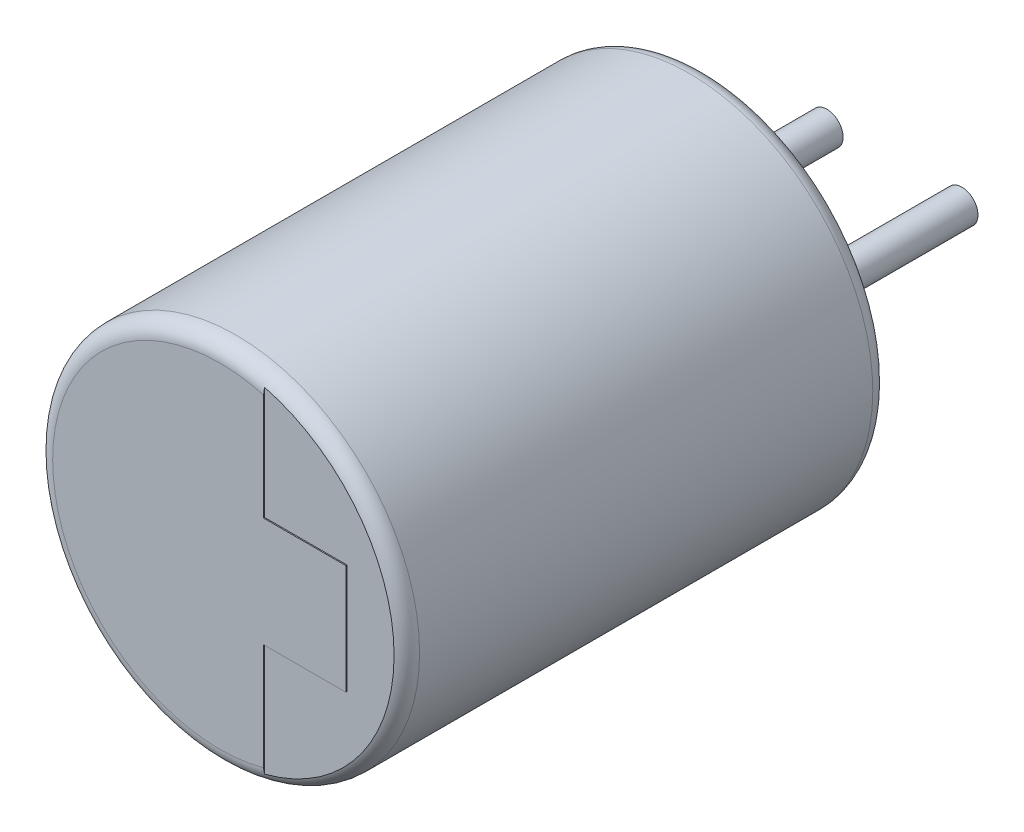
ISO-10303-21;
HEADER;
FILE_DESCRIPTION(('STEP AP214'),'2;1');
FILE_NAME('part.step','',(''),(''),'','','');
FILE_SCHEMA(('AUTOMOTIVE_DESIGN { 1 0 10303 214 1 1 1 1 }'));
ENDSEC;
DATA;
#1=APPLICATION_CONTEXT('core data for automotive mechanical design processes');
#2=APPLICATION_PROTOCOL_DEFINITION('international standard','automotive_design',2000,#1);
#3=PRODUCT_CONTEXT('',#1,'mechanical');
#4=PRODUCT('Part','Part','',(#3));
#5=PRODUCT_RELATED_PRODUCT_CATEGORY('part','',(#4));
#6=PRODUCT_DEFINITION_FORMATION('','',#4);
#7=PRODUCT_DEFINITION_CONTEXT('part definition',#1,'design');
#8=PRODUCT_DEFINITION('design','',#6,#7);
#9=PRODUCT_DEFINITION_SHAPE('','',#8);
#10=(LENGTH_UNIT() NAMED_UNIT(*) SI_UNIT(.MILLI.,.METRE.));
#11=(NAMED_UNIT(*) PLANE_ANGLE_UNIT() SI_UNIT($,.RADIAN.));
#12=(NAMED_UNIT(*) SI_UNIT($,.STERADIAN.) SOLID_ANGLE_UNIT());
#13=UNCERTAINTY_MEASURE_WITH_UNIT(LENGTH_MEASURE(1.E-05),#10,'distance_accuracy_value','');
#14=(GEOMETRIC_REPRESENTATION_CONTEXT(3) GLOBAL_UNCERTAINTY_ASSIGNED_CONTEXT((#13)) GLOBAL_UNIT_ASSIGNED_CONTEXT((#10,
#11,#12)) REPRESENTATION_CONTEXT('',''));
#15=CARTESIAN_POINT('',(0.,0.,0.));
#16=DIRECTION('',(0.,0.,1.));
#17=DIRECTION('',(1.,0.,0.));
#18=AXIS2_PLACEMENT_3D('',#15,#16,#17);
#19=CARTESIAN_POINT('',(0.,0.,-3.5));
#20=DIRECTION('',(0.,0.,1.));
#21=DIRECTION('',(1.,0.,0.));
#22=AXIS2_PLACEMENT_3D('',#19,#20,#21);
#23=PLANE('',#22);
#24=CARTESIAN_POINT('',(-1.25,0.,-3.5));
#25=DIRECTION('',(0.,0.,1.));
#26=DIRECTION('',(1.,0.,0.));
#27=AXIS2_PLACEMENT_3D('',#24,#25,#26);
#28=CIRCLE('',#27,0.3);
#29=CARTESIAN_POINT('',(-0.95,0.,-3.5));
#30=VERTEX_POINT('',#29);
#31=EDGE_CURVE('E428',#30,#30,#28,.T.);
#32=ORIENTED_EDGE('',*,*,#31,.F.);
#33=EDGE_LOOP('',(#32));
#34=FACE_BOUND('',#33,.T.);
#35=ADVANCED_FACE('F17',(#34),#23,.F.);
#36=CARTESIAN_POINT('',(0.,0.,-3.5));
#37=DIRECTION('',(0.,0.,1.));
#38=DIRECTION('',(1.,0.,0.));
#39=AXIS2_PLACEMENT_3D('',#36,#37,#38);
#40=PLANE('',#39);
#41=CARTESIAN_POINT('',(1.25,0.,-3.5));
#42=DIRECTION('',(0.,0.,1.));
#43=DIRECTION('',(1.,0.,0.));
#44=AXIS2_PLACEMENT_3D('',#41,#42,#43);
#45=CIRCLE('',#44,0.3);
#46=CARTESIAN_POINT('',(1.55,0.,-3.5));
#47=VERTEX_POINT('',#46);
#48=EDGE_CURVE('E130',#47,#47,#45,.T.);
#49=ORIENTED_EDGE('',*,*,#48,.F.);
#50=EDGE_LOOP('',(#49));
#51=FACE_BOUND('',#50,.T.);
#52=ADVANCED_FACE('F369',(#51),#40,.F.);
#53=CARTESIAN_POINT('',(-1.25,0.,0.));
#54=DIRECTION('',(0.,0.,1.));
#55=DIRECTION('',(1.,0.,0.));
#56=AXIS2_PLACEMENT_3D('',#53,#54,#55);
#57=CYLINDRICAL_SURFACE('',#56,0.3);
#58=ORIENTED_EDGE('',*,*,#31,.T.);
#59=EDGE_LOOP('',(#58));
#60=FACE_BOUND('',#59,.T.);
#61=CARTESIAN_POINT('',(-1.25,0.,0.));
#62=DIRECTION('',(0.,0.,1.));
#63=DIRECTION('',(1.,0.,0.));
#64=AXIS2_PLACEMENT_3D('',#61,#62,#63);
#65=CIRCLE('',#64,0.3);
#66=CARTESIAN_POINT('',(-0.95,0.,0.));
#67=VERTEX_POINT('',#66);
#68=EDGE_CURVE('E93',#67,#67,#65,.F.);
#69=ORIENTED_EDGE('',*,*,#68,.T.);
#70=EDGE_LOOP('',(#69));
#71=FACE_BOUND('',#70,.T.);
#72=ADVANCED_FACE('F360',(#60,#71),#57,.T.);
#73=CARTESIAN_POINT('',(1.25,0.,0.));
#74=DIRECTION('',(0.,0.,1.));
#75=DIRECTION('',(1.,0.,0.));
#76=AXIS2_PLACEMENT_3D('',#73,#74,#75);
#77=CYLINDRICAL_SURFACE('',#76,0.3);
#78=ORIENTED_EDGE('',*,*,#48,.T.);
#79=EDGE_LOOP('',(#78));
#80=FACE_BOUND('',#79,.T.);
#81=CARTESIAN_POINT('',(1.25,0.,0.));
#82=DIRECTION('',(0.,0.,1.));
#83=DIRECTION('',(1.,0.,0.));
#84=AXIS2_PLACEMENT_3D('',#81,#82,#83);
#85=CIRCLE('',#84,0.3);
#86=CARTESIAN_POINT('',(1.55,0.,0.));
#87=VERTEX_POINT('',#86);
#88=EDGE_CURVE('E159',#87,#87,#85,.F.);
#89=ORIENTED_EDGE('',*,*,#88,.T.);
#90=EDGE_LOOP('',(#89));
#91=FACE_BOUND('',#90,.T.);
#92=ADVANCED_FACE('F287',(#80,#91),#77,.T.);
#93=CARTESIAN_POINT('',(0.8104295157508,-1.016,9.));
#94=DIRECTION('',(-1.,0.,0.));
#95=DIRECTION('',(0.,0.,1.));
#96=AXIS2_PLACEMENT_3D('',#93,#94,#95);
#97=PLANE('',#96);
#98=DIRECTION('',(0.,1.,0.));
#99=VECTOR('',#98,1.);
#100=CARTESIAN_POINT('',(0.8104295157508,0.,8.98));
#101=LINE('',#100,#99);
#102=CARTESIAN_POINT('',(0.8104295157508,-1.016,8.98));
#103=VERTEX_POINT('',#102);
#104=CARTESIAN_POINT('',(0.810429515750799,-3.10363729132195,8.98000000000002));
#105=VERTEX_POINT('',#104);
#106=EDGE_CURVE('E136',#103,#105,#101,.F.);
#107=ORIENTED_EDGE('',*,*,#106,.F.);
#108=DIRECTION('',(0.,0.,1.));
#109=VECTOR('',#108,1.);
#110=CARTESIAN_POINT('',(0.8104295157508,-1.016,9.));
#111=LINE('',#110,#109);
#112=CARTESIAN_POINT('',(0.8104295157508,-1.016,9.));
#113=VERTEX_POINT('',#112);
#114=EDGE_CURVE('E122',#103,#113,#111,.T.);
#115=ORIENTED_EDGE('',*,*,#114,.T.);
#116=DIRECTION('',(0.,1.,0.));
#117=VECTOR('',#116,1.);
#118=CARTESIAN_POINT('',(0.8104295157508,0.,9.));
#119=LINE('',#118,#117);
#120=CARTESIAN_POINT('',(0.8104295157508,-2.992190501957,9.));
#121=VERTEX_POINT('',#120);
#122=EDGE_CURVE('E126',#121,#113,#119,.T.);
#123=ORIENTED_EDGE('',*,*,#122,.F.);
#124=CARTESIAN_POINT('',(0.810429515750802,-3.10363729132188,8.98000000000004));
#125=CARTESIAN_POINT('',(0.810429515750801,-3.08565795600687,8.98664959737589));
#126=CARTESIAN_POINT('',(0.8104295157508,-3.06738105590229,8.99164106273048));
#127=CARTESIAN_POINT('',(0.8104295157508,-3.03023212611399,8.99830772939713));
#128=CARTESIAN_POINT('',(0.8104295157508,-3.01136009643028,8.9999829307092));
#129=CARTESIAN_POINT('',(0.8104295157508,-2.992190501957,9.));
#130=B_SPLINE_CURVE_WITH_KNOTS('',3,(#124,#125,#126,#127,#128,#129),.UNSPECIFIED.,.F.,.F.,(4,2,
4),(0.,0.0568387036654606,0.11367740733092),.UNSPECIFIED.);
#131=EDGE_CURVE('E72',#105,#121,#130,.T.);
#132=ORIENTED_EDGE('',*,*,#131,.F.);
#133=EDGE_LOOP('',(#107,#115,#123,#132));
#134=FACE_BOUND('',#133,.T.);
#135=ADVANCED_FACE('F161',(#134),#97,.F.);
#136=CARTESIAN_POINT('',(2.334429515751,-1.016,9.));
#137=DIRECTION('',(0.,1.,0.));
#138=DIRECTION('',(0.,0.,1.));
#139=AXIS2_PLACEMENT_3D('',#136,#137,#138);
#140=PLANE('',#139);
#141=DIRECTION('',(1.,0.,0.));
#142=VECTOR('',#141,1.);
#143=CARTESIAN_POINT('',(0.,-1.016,8.98));
#144=LINE('',#143,#142);
#145=CARTESIAN_POINT('',(2.334429515751,-1.016,8.98));
#146=VERTEX_POINT('',#145);
#147=EDGE_CURVE('E133',#146,#103,#144,.F.);
#148=ORIENTED_EDGE('',*,*,#147,.F.);
#149=DIRECTION('',(0.,0.,1.));
#150=VECTOR('',#149,1.);
#151=CARTESIAN_POINT('',(2.334429515751,-1.016,9.));
#152=LINE('',#151,#150);
#153=CARTESIAN_POINT('',(2.334429515751,-1.016,9.));
#154=VERTEX_POINT('',#153);
#155=EDGE_CURVE('E116',#146,#154,#152,.T.);
#156=ORIENTED_EDGE('',*,*,#155,.T.);
#157=DIRECTION('',(1.,0.,0.));
#158=VECTOR('',#157,1.);
#159=CARTESIAN_POINT('',(0.,-1.016,9.));
#160=LINE('',#159,#158);
#161=EDGE_CURVE('E107',#113,#154,#160,.T.);
#162=ORIENTED_EDGE('',*,*,#161,.F.);
#163=ORIENTED_EDGE('',*,*,#114,.F.);
#164=EDGE_LOOP('',(#148,#156,#162,#163));
#165=FACE_BOUND('',#164,.T.);
#166=ADVANCED_FACE('F279',(#165),#140,.F.);
#167=CARTESIAN_POINT('',(2.334429515751,1.016,9.));
#168=DIRECTION('',(-1.,0.,0.));
#169=DIRECTION('',(0.,0.,1.));
#170=AXIS2_PLACEMENT_3D('',#167,#168,#169);
#171=PLANE('',#170);
#172=DIRECTION('',(0.,1.,0.));
#173=VECTOR('',#172,1.);
#174=CARTESIAN_POINT('',(2.334429515751,0.,8.98));
#175=LINE('',#174,#173);
#176=CARTESIAN_POINT('',(2.334429515751,1.016,8.98));
#177=VERTEX_POINT('',#176);
#178=EDGE_CURVE('E137',#177,#146,#175,.F.);
#179=ORIENTED_EDGE('',*,*,#178,.F.);
#180=DIRECTION('',(0.,0.,-1.));
#181=VECTOR('',#180,1.);
#182=CARTESIAN_POINT('',(2.334429515751,1.016,9.));
#183=LINE('',#182,#181);
#184=CARTESIAN_POINT('',(2.334429515751,1.016,9.));
#185=VERTEX_POINT('',#184);
#186=EDGE_CURVE('E114',#177,#185,#183,.F.);
#187=ORIENTED_EDGE('',*,*,#186,.T.);
#188=DIRECTION('',(0.,1.,0.));
#189=VECTOR('',#188,1.);
#190=CARTESIAN_POINT('',(2.334429515751,0.,9.));
#191=LINE('',#190,#189);
#192=EDGE_CURVE('E105',#154,#185,#191,.T.);
#193=ORIENTED_EDGE('',*,*,#192,.F.);
#194=ORIENTED_EDGE('',*,*,#155,.F.);
#195=EDGE_LOOP('',(#179,#187,#193,#194));
#196=FACE_BOUND('',#195,.T.);
#197=ADVANCED_FACE('F277',(#196),#171,.F.);
#198=CARTESIAN_POINT('',(0.8104295157508,1.016,9.));
#199=DIRECTION('',(0.,-1.,0.));
#200=DIRECTION('',(0.,0.,-1.));
#201=AXIS2_PLACEMENT_3D('',#198,#199,#200);
#202=PLANE('',#201);
#203=DIRECTION('',(1.,0.,0.));
#204=VECTOR('',#203,1.);
#205=CARTESIAN_POINT('',(0.,1.016,8.98));
#206=LINE('',#205,#204);
#207=CARTESIAN_POINT('',(0.8104295157508,1.016,8.98));
#208=VERTEX_POINT('',#207);
#209=EDGE_CURVE('E91',#208,#177,#206,.T.);
#210=ORIENTED_EDGE('',*,*,#209,.F.);
#211=DIRECTION('',(0.,0.,1.));
#212=VECTOR('',#211,1.);
#213=CARTESIAN_POINT('',(0.8104295157508,1.016,9.));
#214=LINE('',#213,#212);
#215=CARTESIAN_POINT('',(0.8104295157508,1.016,9.));
#216=VERTEX_POINT('',#215);
#217=EDGE_CURVE('E85',#208,#216,#214,.T.);
#218=ORIENTED_EDGE('',*,*,#217,.T.);
#219=DIRECTION('',(1.,0.,0.));
#220=VECTOR('',#219,1.);
#221=CARTESIAN_POINT('',(0.,1.016,9.));
#222=LINE('',#221,#220);
#223=EDGE_CURVE('E88',#185,#216,#222,.F.);
#224=ORIENTED_EDGE('',*,*,#223,.F.);
#225=ORIENTED_EDGE('',*,*,#186,.F.);
#226=EDGE_LOOP('',(#210,#218,#224,#225));
#227=FACE_BOUND('',#226,.T.);
#228=ADVANCED_FACE('F86',(#227),#202,.F.);
#229=CARTESIAN_POINT('',(0.8104295157508,3.302,9.));
#230=DIRECTION('',(-1.,0.,0.));
#231=DIRECTION('',(0.,0.,1.));
#232=AXIS2_PLACEMENT_3D('',#229,#230,#231);
#233=PLANE('',#232);
#234=DIRECTION('',(0.,1.,0.));
#235=VECTOR('',#234,1.);
#236=CARTESIAN_POINT('',(0.8104295157508,0.,8.98));
#237=LINE('',#236,#235);
#238=CARTESIAN_POINT('',(0.810429515746907,3.10363729131648,8.98000000000224));
#239=VERTEX_POINT('',#238);
#240=EDGE_CURVE('E145',#239,#208,#237,.F.);
#241=ORIENTED_EDGE('',*,*,#240,.F.);
#242=CARTESIAN_POINT('',(0.8104295157508,2.99219050195694,9.));
#243=CARTESIAN_POINT('',(0.810429515752097,3.0113600964282,8.99998293070915));
#244=CARTESIAN_POINT('',(0.810429515752098,3.03023212610999,8.99830772939743));
#245=CARTESIAN_POINT('',(0.810429515749503,3.06738105589467,8.99164106273226));
#246=CARTESIAN_POINT('',(0.810429515746907,3.08565795599754,8.98664959737881));
#247=CARTESIAN_POINT('',(0.810429515743015,3.10363729131096,8.98000000000449));
#248=B_SPLINE_CURVE_WITH_KNOTS('',3,(#242,#243,#244,#245,#246,#247),.UNSPECIFIED.,.F.,.F.,(4,2,
4),(0.,0.0568387036596354,0.113677407319271),.UNSPECIFIED.);
#249=CARTESIAN_POINT('',(0.810429515750785,2.99219050195694,9.));
#250=VERTEX_POINT('',#249);
#251=EDGE_CURVE('E37',#250,#239,#248,.T.);
#252=ORIENTED_EDGE('',*,*,#251,.F.);
#253=DIRECTION('',(0.,1.,0.));
#254=VECTOR('',#253,1.);
#255=CARTESIAN_POINT('',(0.8104295157508,0.,9.));
#256=LINE('',#255,#254);
#257=EDGE_CURVE('E95',#216,#250,#256,.T.);
#258=ORIENTED_EDGE('',*,*,#257,.F.);
#259=ORIENTED_EDGE('',*,*,#217,.F.);
#260=EDGE_LOOP('',(#241,#252,#258,#259));
#261=FACE_BOUND('',#260,.T.);
#262=ADVANCED_FACE('F96',(#261),#233,.F.);
#263=CARTESIAN_POINT('',(0.,0.,0.));
#264=DIRECTION('',(0.,0.,1.));
#265=DIRECTION('',(1.,0.,0.));
#266=AXIS2_PLACEMENT_3D('',#263,#264,#265);
#267=PLANE('',#266);
#268=ORIENTED_EDGE('',*,*,#88,.F.);
#269=EDGE_LOOP('',(#268));
#270=FACE_BOUND('',#269,.T.);
#271=ORIENTED_EDGE('',*,*,#68,.F.);
#272=EDGE_LOOP('',(#271));
#273=FACE_BOUND('',#272,.T.);
#274=CARTESIAN_POINT('',(0.,0.,0.));
#275=DIRECTION('',(0.,0.,1.));
#276=DIRECTION('',(1.,3.71315199270041E-13,0.));
#277=AXIS2_PLACEMENT_3D('',#274,#275,#276);
#278=CIRCLE('',#277,3.1);
#279=CARTESIAN_POINT('',(3.1,4.60114395585756E-13,0.));
#280=VERTEX_POINT('',#279);
#281=CARTESIAN_POINT('',(-3.1,-2.29583198155595E-13,0.));
#282=VERTEX_POINT('',#281);
#283=EDGE_CURVE('E100',#280,#282,#278,.T.);
#284=ORIENTED_EDGE('',*,*,#283,.F.);
#285=CARTESIAN_POINT('',(-3.1,0.,0.));
#286=CARTESIAN_POINT('',(-3.10000087094773,-0.00874540352543252,-1.90377946864875E-11));
#287=CARTESIAN_POINT('',(-3.09996510045165,-0.0174910038011301,-1.15515339071451E-11));
#288=CARTESIAN_POINT('',(-3.09955625319305,-0.0668169782746955,1.78049291423559E-10));
#289=CARTESIAN_POINT('',(-3.09842931163099,-0.107394115379762,8.96643971890632E-10));
#290=CARTESIAN_POINT('',(-3.09457900932205,-0.188471190734337,3.38027835577706E-09));
#291=CARTESIAN_POINT('',(-3.09185563243492,-0.228971128199189,5.14532863905345E-09));
#292=CARTESIAN_POINT('',(-3.08443030902835,-0.314325180365604,9.77056386950651E-09));
#293=CARTESIAN_POINT('',(-3.07954219239428,-0.359163259065688,1.27306146132143E-08));
#294=CARTESIAN_POINT('',(-3.06781364443872,-0.448583361777783,1.9492482975175E-08));
#295=CARTESIAN_POINT('',(-3.06097319363195,-0.493165383229683,2.32943089946868E-08));
#296=CARTESIAN_POINT('',(-3.04535334152855,-0.581988997532628,3.15336265123647E-08));
#297=CARTESIAN_POINT('',(-3.03657392215833,-0.626230587206446,3.5971123935648E-08));
#298=CARTESIAN_POINT('',(-3.0170927309397,-0.714288853421245,4.52923649893461E-08));
#299=CARTESIAN_POINT('',(-3.00639094243967,-0.758105526278116,5.01761124850141E-08));
#300=CARTESIAN_POINT('',(-2.98308540200385,-0.845230486306426,6.02136226791498E-08));
#301=CARTESIAN_POINT('',(-2.9704816348468,-0.888538769406308,6.5367387538311E-08));
#302=CARTESIAN_POINT('',(-2.94339612054616,-0.974564391073295,7.57828254808181E-08));
#303=CARTESIAN_POINT('',(-2.92891435961114,-1.0172817252981,8.10444993563767E-08));
#304=CARTESIAN_POINT('',(-2.89810043217517,-1.10204403067603,9.15275222231444E-08));
#305=CARTESIAN_POINT('',(-2.88176825330495,-1.14408899733251,9.67488709445474E-08));
#306=CARTESIAN_POINT('',(-2.84728459149133,-1.22742642625259,1.07016950799622E-07));
#307=CARTESIAN_POINT('',(-2.82913309758569,-1.26871888398018,1.12063680880885E-07));
#308=CARTESIAN_POINT('',(-2.7910453779937,-1.35047258886208,1.21862153823268E-07));
#309=CARTESIAN_POINT('',(-2.77110914272971,-1.39093383155432,1.26613895101127E-07));
#310=CARTESIAN_POINT('',(-2.72948991676272,-1.47094798422656,1.35715948250915E-07));
#311=CARTESIAN_POINT('',(-2.70780691783709,-1.51050088992958,1.40066258232962E-07));
#312=CARTESIAN_POINT('',(-2.6627354727166,-1.58862297808674,1.48272932964779E-07));
#313=CARTESIAN_POINT('',(-2.63934701961755,-1.6271921565576,1.52129295714729E-07));
#314=CARTESIAN_POINT('',(-2.59090922728674,-1.70327327512051,1.5926948697903E-07));
#315=CARTESIAN_POINT('',(-2.56585988242578,-1.74078521162865,1.62553313552769E-07));
#316=CARTESIAN_POINT('',(-2.51414803567386,-1.81468034688766,1.68483770007686E-07));
#317=CARTESIAN_POINT('',(-2.48748552937861,-1.85106354255638,1.71130398149066E-07));
#318=CARTESIAN_POINT('',(-2.43259816575576,-1.92263184897354,1.75735722094892E-07));
#319=CARTESIAN_POINT('',(-2.40437330519222,-1.95781695724026,1.77694416474426E-07));
#320=CARTESIAN_POINT('',(-2.34641501898256,-2.02692202626908,1.80887063875406E-07));
#321=CARTESIAN_POINT('',(-2.31668159120609,-2.06084198524447,1.82121015873362E-07));
#322=CARTESIAN_POINT('',(-2.25576283383658,-2.12735210568354,1.83841296336046E-07));
#323=CARTESIAN_POINT('',(-2.22457750315007,-2.15994226614567,1.84327624237707E-07));
#324=CARTESIAN_POINT('',(-2.16081437241173,-2.22373067552047,1.84543701075755E-07));
#325=CARTESIAN_POINT('',(-2.12823657222891,-2.25492892430219,1.84273449940966E-07));
#326=CARTESIAN_POINT('',(-2.06175059071444,-2.31587405079688,1.82981340045989E-07));
#327=CARTESIAN_POINT('',(-2.02784241013446,-2.34562092932986,1.81959481710451E-07));
#328=CARTESIAN_POINT('',(-1.95876029331534,-2.40360662380609,1.79183055678583E-07));
#329=CARTESIAN_POINT('',(-1.92358635862561,-2.43184544159525,1.7742848887913E-07));
#330=CARTESIAN_POINT('',(-1.85203977301206,-2.48676119925456,1.73219470959161E-07));
#331=CARTESIAN_POINT('',(-1.81566712434569,-2.51343814206582,1.70765021156616E-07));
#332=CARTESIAN_POINT('',(-1.74179243619141,-2.56517931333245,1.65202989222467E-07));
#333=CARTESIAN_POINT('',(-1.70429039957486,-2.59024354588748,1.62095408751265E-07));
#334=CARTESIAN_POINT('',(-1.62822841460759,-2.6387115361073,1.55287794355527E-07));
#335=CARTESIAN_POINT('',(-1.5896684696439,-2.66211529908745,1.51587762327625E-07));
#336=CARTESIAN_POINT('',(-1.51156416431678,-2.70721775666589,1.43669850623358E-07));
#337=CARTESIAN_POINT('',(-1.4720198077541,-2.72891645784598,1.39451972946121E-07));
#338=CARTESIAN_POINT('',(-1.39202205254008,-2.77056745044894,1.30586903271379E-07));
#339=CARTESIAN_POINT('',(-1.35156865799789,-2.79051974976414,1.25939713214219E-07));
#340=CARTESIAN_POINT('',(-1.26982993322447,-2.82863992830695,1.16318476290054E-07));
#341=CARTESIAN_POINT('',(-1.22854460730253,-2.8468078167747,1.11344431115813E-07));
#342=CARTESIAN_POINT('',(-1.14522071218736,-2.8813245666552,1.01185879886511E-07));
#343=CARTESIAN_POINT('',(-1.1031821473927,-2.89767343868616,9.6001375060215E-08));
#344=CARTESIAN_POINT('',(-1.0184319023984,-2.92852101883402,8.55521844599074E-08));
#345=CARTESIAN_POINT('',(-0.975720226573609,-2.9430197389703,8.02874992070308E-08));
#346=CARTESIAN_POINT('',(-0.889705171284066,-2.97013940523328,6.98223161433105E-08));
#347=CARTESIAN_POINT('',(-0.84640179605567,-2.98276036479639,6.46218178734181E-08));
#348=CARTESIAN_POINT('',(-0.759285877055792,-3.00610048942164,5.44427013147506E-08));
#349=CARTESIAN_POINT('',(-0.715473337266124,-3.0168196693456,4.94640812922935E-08));
#350=CARTESIAN_POINT('',(-0.627422609369748,-3.03633581156709,3.99025920213333E-08));
#351=CARTESIAN_POINT('',(-0.583184424873213,-3.04513279015309,3.53197194195191E-08));
#352=CARTESIAN_POINT('',(-0.494366681374227,-3.06078788479752,2.67291213463999E-08));
#353=CARTESIAN_POINT('',(-0.449787125493365,-3.06764601856358,2.2721390622446E-08));
#354=CARTESIAN_POINT('',(-0.360371774978606,-3.07941005889477,1.55057548784049E-08));
#355=CARTESIAN_POINT('',(-0.315535982858218,-3.08431598457656,1.22978420263585E-08));
#356=CARTESIAN_POINT('',(-0.223447872296579,-3.09236373152884,6.66612949178635E-09));
#357=CARTESIAN_POINT('',(-0.176186750898625,-3.09540515493298,4.28951988487394E-09));
#358=CARTESIAN_POINT('',(-0.0815750505290923,-3.09931552135025,1.188835874433E-09));
#359=CARTESIAN_POINT('',(-0.0342244726107302,-3.1001844897832,4.64742134881144E-10));
#360=CARTESIAN_POINT('',(0.0542277891540582,-3.09979378608559,-3.73059511847482E-10));
#361=CARTESIAN_POINT('',(0.0953309045131549,-3.09879946226567,-5.54613249062244E-10));
#362=CARTESIAN_POINT('',(0.177465035257134,-3.09520373392386,6.01690293349801E-10));
#363=CARTESIAN_POINT('',(0.218496053674072,-3.09260239869011,1.93948206673917E-09));
#364=CARTESIAN_POINT('',(0.306951815917189,-3.08524627058844,1.67091832233026E-08));
#365=CARTESIAN_POINT('',(0.354353709573143,-3.08021441544683,3.20339945556944E-08));
#366=CARTESIAN_POINT('',(0.448882257091827,-3.06801359775497,1.56337839452962E-07));
#367=CARTESIAN_POINT('',(0.496008909346236,-3.06084462272957,2.65317419721814E-07));
#368=CARTESIAN_POINT('',(0.581198057792678,-3.04585392405521,5.23535544758878E-07));
#369=CARTESIAN_POINT('',(0.619325082175938,-3.03839809239919,6.61601832711607E-07));
#370=CARTESIAN_POINT('',(0.695252898608898,-3.02199573106119,8.11552843457261E-07));
#371=CARTESIAN_POINT('',(0.733053720830343,-3.0130493408356,8.23449363943758E-07));
#372=CARTESIAN_POINT('',(0.818921782260547,-2.99097945200985,7.14862875890657E-07));
#373=CARTESIAN_POINT('',(0.866870349405653,-2.97739007190655,5.56005747790429E-07));
#374=CARTESIAN_POINT('',(0.961983841086918,-2.9477447913371,2.1532379022518E-07));
#375=CARTESIAN_POINT('',(1.00914896556119,-2.93168953123433,3.35049258565882E-08));
#376=CARTESIAN_POINT('',(1.07209232875277,-2.90876368383236,-9.76586612535407E-09));
#377=CARTESIAN_POINT('',(1.08819551894687,-2.90276463627444,-3.04908393978323E-09));
#378=CARTESIAN_POINT('',(1.13597516738902,-2.88454494776152,7.15089391603031E-09));
#379=CARTESIAN_POINT('',(1.16751632609075,-2.87196495278447,1.08471154894227E-09));
#380=CARTESIAN_POINT('',(1.23587679709944,-2.84339139887416,1.14929522365997E-08));
#381=CARTESIAN_POINT('',(1.2726105915645,-2.82719352927366,3.22761718259392E-08));
#382=CARTESIAN_POINT('',(1.35556453639539,-2.78868975168717,1.21733306255534E-07));
#383=CARTESIAN_POINT('',(1.40157962108637,-2.76593853021544,2.02125699863623E-07));
#384=CARTESIAN_POINT('',(1.46075377736137,-2.73482598893175,3.46873407081302E-07));
#385=CARTESIAN_POINT('',(1.47445786936636,-2.7274882529614,3.833479073204E-07));
#386=CARTESIAN_POINT('',(1.50152544017619,-2.71272748432957,4.53060921763703E-07));
#387=CARTESIAN_POINT('',(1.51489079608612,-2.70530789180555,4.86343116123327E-07));
#388=CARTESIAN_POINT('',(1.57901108801008,-2.66908072716422,6.39562995331523E-07));
#389=CARTESIAN_POINT('',(1.62900910652065,-2.6389135509094,7.39438240923657E-07));
#390=CARTESIAN_POINT('',(1.72372338611492,-2.57796967065367,7.66145730643014E-07));
#391=CARTESIAN_POINT('',(1.76856379998853,-2.54738507187879,7.04654762180596E-07));
#392=CARTESIAN_POINT('',(1.85033471483018,-2.48837177375189,5.49414488568671E-07));
#393=CARTESIAN_POINT('',(1.88748697120031,-2.46024996722645,4.61457716696824E-07));
#394=CARTESIAN_POINT('',(1.95817269980144,-2.40421661905194,3.35236445639345E-07));
#395=CARTESIAN_POINT('',(1.99178599364044,-2.37640561918186,2.94165435885208E-07));
#396=CARTESIAN_POINT('',(2.06432632159976,-2.31377234111916,2.20276650873685E-07));
#397=CARTESIAN_POINT('',(2.10299411721844,-2.27864892847353,1.9068345223646E-07));
#398=CARTESIAN_POINT('',(2.17490252193497,-2.20996048818776,1.55230558876123E-07));
#399=CARTESIAN_POINT('',(2.20830834171673,-2.17656808540012,1.47370299913986E-07));
#400=CARTESIAN_POINT('',(2.27012002164589,-2.11191831411777,1.50271511470849E-07));
#401=CARTESIAN_POINT('',(2.29868087164771,-2.08080901583686,1.59150188580818E-07));
#402=CARTESIAN_POINT('',(2.35121859398823,-2.02121129381979,1.97382189360346E-07));
#403=CARTESIAN_POINT('',(2.37533792861007,-1.99284844539181,2.24187898890122E-07));
#404=CARTESIAN_POINT('',(2.41188281621171,-1.94830912260376,3.08828382810799E-07));
#405=CARTESIAN_POINT('',(2.42466358783334,-1.93242263538666,3.47146787691411E-07));
#406=CARTESIAN_POINT('',(2.45714225279456,-1.8912292892524,4.60008593058124E-07));
#407=CARTESIAN_POINT('',(2.47660869853455,-1.865739029234,5.42729204087301E-07));
#408=CARTESIAN_POINT('',(2.51472991984263,-1.81415895080163,6.94469179541252E-07));
#409=CARTESIAN_POINT('',(2.53338467590994,-1.78806911800597,7.63488214928797E-07));
#410=CARTESIAN_POINT('',(2.57795489677453,-1.72362498392167,9.12209935886772E-07));
#411=CARTESIAN_POINT('',(2.60342359276536,-1.68496030307589,9.83088117442066E-07));
#412=CARTESIAN_POINT('',(2.65258496633669,-1.60651928037248,1.06959744426917E-06));
#413=CARTESIAN_POINT('',(2.67627764394681,-1.5667429385334,1.08522859046285E-06));
#414=CARTESIAN_POINT('',(2.72184011718943,-1.48616011349793,1.05883931273676E-06));
#415=CARTESIAN_POINT('',(2.74370995017554,-1.44535365143303,1.01682007049363E-06));
#416=CARTESIAN_POINT('',(2.78557860573591,-1.36279473140081,8.8387386614858E-07));
#417=CARTESIAN_POINT('',(2.80557750494207,-1.3210423122662,7.92948908215204E-07));
#418=CARTESIAN_POINT('',(2.84659746171055,-1.2302037495346,5.74193202220112E-07));
#419=CARTESIAN_POINT('',(2.86730441316872,-1.18097543338543,4.42840184065711E-07));
#420=CARTESIAN_POINT('',(2.90608664228571,-1.08149568888522,1.915506664857E-07));
#421=CARTESIAN_POINT('',(2.92416217805269,-1.03124436143035,7.16130477558131E-08));
#422=CARTESIAN_POINT('',(2.94364689211801,-0.972537791830096,2.81457965280766E-08));
#423=CARTESIAN_POINT('',(2.94628574185648,-0.964480856093452,2.42675229507343E-08));
#424=CARTESIAN_POINT('',(2.95364035853104,-0.941732784132007,1.6166378548765E-08));
#425=CARTESIAN_POINT('',(2.95828503517833,-0.927018501983794,1.42681541004004E-08));
#426=CARTESIAN_POINT('',(2.97081029897725,-0.88628506144148,9.71561899310897E-09));
#427=CARTESIAN_POINT('',(2.97845998328009,-0.86019466123831,7.58723149745107E-09));
#428=CARTESIAN_POINT('',(2.99568160036837,-0.798477401828928,4.04895493537293E-09));
#429=CARTESIAN_POINT('',(3.00496536163781,-0.762769859927548,3.16649523018276E-09));
#430=CARTESIAN_POINT('',(3.02452772809727,-0.681615261012502,1.64195887027536E-09));
#431=CARTESIAN_POINT('',(3.03442592691617,-0.636076338222041,1.12412402650011E-09));
#432=CARTESIAN_POINT('',(3.05400858415121,-0.535071441864677,3.83530801190402E-10));
#433=CARTESIAN_POINT('',(3.06321950048583,-0.479512604865132,2.4465189812281E-10));
#434=CARTESIAN_POINT('',(3.07525457628239,-0.392262298317448,1.05628029322498E-10));
#435=CARTESIAN_POINT('',(3.0791135169629,-0.360709493741917,7.14074349516927E-11));
#436=CARTESIAN_POINT('',(3.0861172290186,-0.295087332887888,2.5497946457852E-11));
#437=CARTESIAN_POINT('',(3.08918503705305,-0.261009666120634,1.57275847429577E-11));
#438=CARTESIAN_POINT('',(3.09436872752537,-0.190352689748368,3.3228454873194E-12));
#439=CARTESIAN_POINT('',(3.0964017050473,-0.153767302353357,1.24347445685982E-12));
#440=CARTESIAN_POINT('',(3.09926187523988,-0.0781236435478829,0.));
#441=CARTESIAN_POINT('',(3.10000033560284,-0.0390620003979504,8.9671265611379E-13));
#442=CARTESIAN_POINT('',(3.1,0.,0.));
#443=B_SPLINE_CURVE_WITH_KNOTS('',3,(#285,#286,#287,#288,#289,#290,#291,#292,#293,#294,#295,
#296,#297,#298,#299,#300,#301,#302,#303,#304,#305,#306,#307,#308,#309,#310,#311,#312,#313,#314,
#315,#316,#317,#318,#319,#320,#321,#322,#323,#324,#325,#326,#327,#328,#329,#330,#331,#332,#333,
#334,#335,#336,#337,#338,#339,#340,#341,#342,#343,#344,#345,#346,#347,#348,#349,#350,#351,#352,
#353,#354,#355,#356,#357,#358,#359,#360,#361,#362,#363,#364,#365,#366,#367,#368,#369,#370,#371,
#372,#373,#374,#375,#376,#377,#378,#379,#380,#381,#382,#383,#384,#385,#386,#387,#388,#389,#390,
#391,#392,#393,#394,#395,#396,#397,#398,#399,#400,#401,#402,#403,#404,#405,#406,#407,#408,#409,
#410,#411,#412,#413,#414,#415,#416,#417,#418,#419,#420,#421,#422,#423,#424,#425,#426,#427,#428,
#429,#430,#431,#432,#433,#434,#435,#436,#437,#438,#439,#440,#441,#442),.UNSPECIFIED.,.F.,.F.,(4,
2,2,2,2,2,2,2,2,2,2,2,2,2,2,2,2,2,2,2,2,2,2,2,2,2,2,2,2,2,2,2,2,2,2,2,2,2,2,2,2,2,2,2,2,2,2,2,2,
2,2,2,2,2,2,2,2,2,2,2,2,2,2,2,2,2,2,2,2,2,2,2,2,2,2,2,2,2,4),(0.,0.0262366661832859,
0.147979831796778,0.269724228276873,0.404991434905706,0.540259991616993,0.675529809253625,
0.810800798658501,0.946072870674519,1.08134593614457,1.21661990591158,1.35189469081846,
1.48717020170811,1.6224463494235,1.75772304480754,1.89300019870322,2.02827772195347,
2.16355552540128,2.29883351988962,2.43411161626146,2.56938972535979,2.70466775802759,
2.83994562510783,2.9752232374435,3.11050050587757,3.24577734125299,3.38105365441274,
3.51632935619975,3.65160435745696,3.7868785690273,3.9221519017537,4.05742426647905,
4.19269557404627,4.32796573529825,4.46323466107789,4.59850226222809,4.74052891348461,
4.88255390288433,5.00586833166489,5.12917744397362,5.27213241892162,5.41508822836619,
5.53160693178681,5.64811473985503,5.79755902488163,5.94696456619872,5.99851713983773,
6.10036973280995,6.22078200862831,6.3747056080184,6.42133915363026,6.46719826684344,
6.64226999149769,6.80502816536027,6.94476657543568,7.07561085837007,7.23225696993109,
7.3739094744299,7.50057013765645,7.61224007068047,7.67340545527541,7.76960800165149,
7.86581285800943,8.00466018024644,8.1435075001666,8.28235197413573,8.4211907586568,
8.5813355535447,8.74146462968194,8.76689890473636,8.81318702311653,8.89474383287239,
9.00540419898251,9.14516544764787,9.31402439929523,9.40937558135149,9.51200254640859,
9.6219051789426,9.73908336191328),.UNSPECIFIED.);
#444=EDGE_CURVE('E151',#282,#280,#443,.T.);
#445=ORIENTED_EDGE('',*,*,#444,.F.);
#446=EDGE_LOOP('',(#284,#445));
#447=FACE_BOUND('',#446,.T.);
#448=ADVANCED_FACE('F171',(#270,#273,#447),#267,.F.);
#449=CARTESIAN_POINT('',(0.,0.,8.98));
#450=DIRECTION('',(0.,0.,1.));
#451=DIRECTION('',(1.,0.,0.));
#452=AXIS2_PLACEMENT_3D('',#449,#450,#451);
#453=PLANE('',#452);
#454=ORIENTED_EDGE('',*,*,#106,.T.);
#455=CARTESIAN_POINT('',(0.,0.,8.98));
#456=DIRECTION('',(0.,0.,1.));
#457=DIRECTION('',(1.,0.,0.));
#458=AXIS2_PLACEMENT_3D('',#455,#456,#457);
#459=CIRCLE('',#458,3.20770329614269);
#460=EDGE_CURVE('E69',#239,#105,#459,.F.);
#461=ORIENTED_EDGE('',*,*,#460,.F.);
#462=ORIENTED_EDGE('',*,*,#240,.T.);
#463=ORIENTED_EDGE('',*,*,#209,.T.);
#464=ORIENTED_EDGE('',*,*,#178,.T.);
#465=ORIENTED_EDGE('',*,*,#147,.T.);
#466=EDGE_LOOP('',(#454,#461,#462,#463,#464,#465));
#467=FACE_BOUND('',#466,.T.);
#468=ADVANCED_FACE('F169',(#467),#453,.T.);
#469=CARTESIAN_POINT('',(0.,0.,9.));
#470=DIRECTION('',(0.,0.,1.));
#471=DIRECTION('',(1.,0.,0.));
#472=AXIS2_PLACEMENT_3D('',#469,#470,#471);
#473=PLANE('',#472);
#474=ORIENTED_EDGE('',*,*,#223,.T.);
#475=ORIENTED_EDGE('',*,*,#257,.T.);
#476=CARTESIAN_POINT('',(0.,0.,9.));
#477=DIRECTION('',(0.,0.,-1.));
#478=DIRECTION('',(-1.,0.,0.));
#479=AXIS2_PLACEMENT_3D('',#476,#477,#478);
#480=CIRCLE('',#479,3.1);
#481=CARTESIAN_POINT('',(-3.10000000000009,0.,9.));
#482=VERTEX_POINT('',#481);
#483=EDGE_CURVE('E149',#482,#250,#480,.T.);
#484=ORIENTED_EDGE('',*,*,#483,.F.);
#485=CARTESIAN_POINT('',(0.,0.,9.));
#486=DIRECTION('',(0.,0.,-1.));
#487=DIRECTION('',(0.261428876048621,-0.965222742566686,0.));
#488=AXIS2_PLACEMENT_3D('',#485,#486,#487);
#489=CIRCLE('',#488,3.10000000000028);
#490=EDGE_CURVE('E237',#482,#121,#489,.F.);
#491=ORIENTED_EDGE('',*,*,#490,.T.);
#492=ORIENTED_EDGE('',*,*,#122,.T.);
#493=ORIENTED_EDGE('',*,*,#161,.T.);
#494=ORIENTED_EDGE('',*,*,#192,.T.);
#495=EDGE_LOOP('',(#474,#475,#484,#491,#492,#493,#494));
#496=FACE_BOUND('',#495,.T.);
#497=ADVANCED_FACE('F102',(#496),#473,.T.);
#498=CARTESIAN_POINT('',(0.,0.,0.3));
#499=DIRECTION('',(0.,0.,1.));
#500=DIRECTION('',(-0.999964185128448,-0.0084633598765374,0.));
#501=AXIS2_PLACEMENT_3D('',#498,#499,#500);
#502=TOROIDAL_SURFACE('',#501,3.1,0.3);
#503=CARTESIAN_POINT('',(0.,0.,0.3));
#504=DIRECTION('',(0.,0.,1.));
#505=DIRECTION('',(1.,0.,0.));
#506=AXIS2_PLACEMENT_3D('',#503,#504,#505);
#507=CIRCLE('',#506,3.4);
#508=CARTESIAN_POINT('',(3.4,0.,0.3));
#509=VERTEX_POINT('',#508);
#510=EDGE_CURVE('E28',#509,#509,#507,.T.);
#511=ORIENTED_EDGE('',*,*,#510,.F.);
#512=EDGE_LOOP('',(#511));
#513=FACE_BOUND('',#512,.T.);
#514=ORIENTED_EDGE('',*,*,#283,.T.);
#515=ORIENTED_EDGE('',*,*,#444,.T.);
#516=EDGE_LOOP('',(#514,#515));
#517=FACE_BOUND('',#516,.T.);
#518=ADVANCED_FACE('F206',(#513,#517),#502,.T.);
#519=CARTESIAN_POINT('',(0.,0.,8.7));
#520=DIRECTION('',(0.,0.,1.));
#521=DIRECTION('',(0.999982252049581,-0.00595781720508788,0.));
#522=AXIS2_PLACEMENT_3D('',#519,#520,#521);
#523=TOROIDAL_SURFACE('',#522,3.1,0.3);
#524=CARTESIAN_POINT('',(0.,0.,8.7));
#525=DIRECTION('',(0.,0.,1.));
#526=DIRECTION('',(1.,0.,0.));
#527=AXIS2_PLACEMENT_3D('',#524,#525,#526);
#528=CIRCLE('',#527,3.4);
#529=CARTESIAN_POINT('',(3.4,0.,8.7));
#530=VERTEX_POINT('',#529);
#531=EDGE_CURVE('E11',#530,#530,#528,.F.);
#532=ORIENTED_EDGE('',*,*,#531,.F.);
#533=EDGE_LOOP('',(#532));
#534=FACE_BOUND('',#533,.T.);
#535=ORIENTED_EDGE('',*,*,#483,.T.);
#536=ORIENTED_EDGE('',*,*,#251,.T.);
#537=ORIENTED_EDGE('',*,*,#460,.T.);
#538=ORIENTED_EDGE('',*,*,#131,.T.);
#539=ORIENTED_EDGE('',*,*,#490,.F.);
#540=EDGE_LOOP('',(#535,#536,#537,#538,#539));
#541=FACE_BOUND('',#540,.T.);
#542=ADVANCED_FACE('F215',(#534,#541),#523,.T.);
#543=CARTESIAN_POINT('',(0.,0.,0.));
#544=DIRECTION('',(0.,0.,1.));
#545=DIRECTION('',(1.,0.,0.));
#546=AXIS2_PLACEMENT_3D('',#543,#544,#545);
#547=CYLINDRICAL_SURFACE('',#546,3.4);
#548=ORIENTED_EDGE('',*,*,#510,.T.);
#549=EDGE_LOOP('',(#548));
#550=FACE_BOUND('',#549,.T.);
#551=ORIENTED_EDGE('',*,*,#531,.T.);
#552=EDGE_LOOP('',(#551));
#553=FACE_BOUND('',#552,.T.);
#554=ADVANCED_FACE('F290',(#550,#553),#547,.T.);
#555=CLOSED_SHELL('',(#35,#52,#72,#92,#135,#166,#197,#228,#262,#448,#468,#497,#518,#542,#554));
#556=MANIFOLD_SOLID_BREP('B1',#555);
#557=ADVANCED_BREP_SHAPE_REPRESENTATION('',(#18,#556),#14);
#558=SHAPE_DEFINITION_REPRESENTATION(#9,#557);
ENDSEC;
END-ISO-10303-21;
